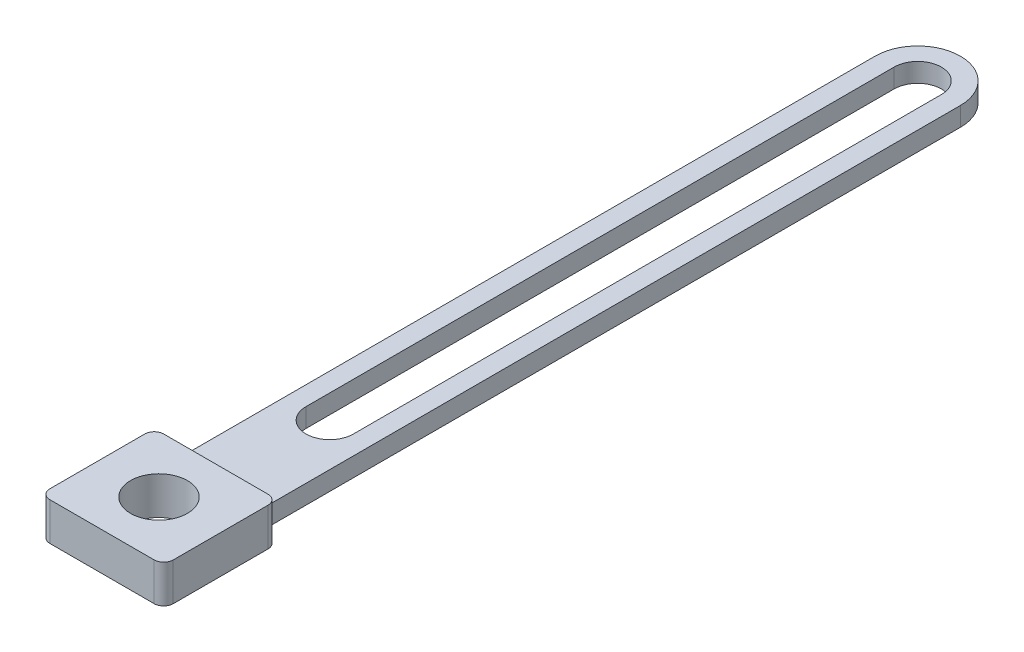
ISO-10303-21;
HEADER;
FILE_DESCRIPTION(('STEP AP214'),'2;1');
FILE_NAME('part.step','',(''),(''),'','','');
FILE_SCHEMA(('AUTOMOTIVE_DESIGN { 1 0 10303 214 1 1 1 1 }'));
ENDSEC;
DATA;
#1=APPLICATION_CONTEXT('core data for automotive mechanical design processes');
#2=APPLICATION_PROTOCOL_DEFINITION('international standard','automotive_design',2000,#1);
#3=PRODUCT_CONTEXT('',#1,'mechanical');
#4=PRODUCT('Part','Part','',(#3));
#5=PRODUCT_RELATED_PRODUCT_CATEGORY('part','',(#4));
#6=PRODUCT_DEFINITION_FORMATION('','',#4);
#7=PRODUCT_DEFINITION_CONTEXT('part definition',#1,'design');
#8=PRODUCT_DEFINITION('design','',#6,#7);
#9=PRODUCT_DEFINITION_SHAPE('','',#8);
#10=(LENGTH_UNIT() NAMED_UNIT(*) SI_UNIT(.MILLI.,.METRE.));
#11=(NAMED_UNIT(*) PLANE_ANGLE_UNIT() SI_UNIT($,.RADIAN.));
#12=(NAMED_UNIT(*) SI_UNIT($,.STERADIAN.) SOLID_ANGLE_UNIT());
#13=UNCERTAINTY_MEASURE_WITH_UNIT(LENGTH_MEASURE(1.E-05),#10,'distance_accuracy_value','');
#14=(GEOMETRIC_REPRESENTATION_CONTEXT(3) GLOBAL_UNCERTAINTY_ASSIGNED_CONTEXT((#13)) GLOBAL_UNIT_ASSIGNED_CONTEXT((#10,
#11,#12)) REPRESENTATION_CONTEXT('',''));
#15=CARTESIAN_POINT('',(0.,0.,0.));
#16=DIRECTION('',(0.,0.,1.));
#17=DIRECTION('',(1.,0.,0.));
#18=AXIS2_PLACEMENT_3D('',#15,#16,#17);
#19=CARTESIAN_POINT('',(-7.38157894736842,1.,-14.9605263157895));
#20=DIRECTION('',(1.,0.,0.));
#21=DIRECTION('',(0.,0.,-1.));
#22=AXIS2_PLACEMENT_3D('',#19,#20,#21);
#23=PLANE('',#22);
#24=DIRECTION('',(0.,-1.,0.));
#25=VECTOR('',#24,1.);
#26=CARTESIAN_POINT('',(-7.38157894736841,1.,59.0394736842105));
#27=LINE('',#26,#25);
#28=CARTESIAN_POINT('',(-7.38157894736842,1.,59.0394736842105));
#29=VERTEX_POINT('',#28);
#30=CARTESIAN_POINT('',(-7.38157894736841,-1.,59.0394736842105));
#31=VERTEX_POINT('',#30);
#32=EDGE_CURVE('E178',#29,#31,#27,.T.);
#33=ORIENTED_EDGE('',*,*,#32,.F.);
#34=DIRECTION('',(0.,0.,1.));
#35=VECTOR('',#34,1.);
#36=CARTESIAN_POINT('',(-7.38157894736842,1.,-14.9605263157895));
#37=LINE('',#36,#35);
#38=CARTESIAN_POINT('',(-7.38157894736842,1.,-14.9605263157895));
#39=VERTEX_POINT('',#38);
#40=EDGE_CURVE('E163',#39,#29,#37,.T.);
#41=ORIENTED_EDGE('',*,*,#40,.F.);
#42=DIRECTION('',(0.,-1.,0.));
#43=VECTOR('',#42,1.);
#44=CARTESIAN_POINT('',(-7.38157894736842,1.,-14.9605263157895));
#45=LINE('',#44,#43);
#46=CARTESIAN_POINT('',(-7.38157894736842,-1.,-14.9605263157895));
#47=VERTEX_POINT('',#46);
#48=EDGE_CURVE('E263',#39,#47,#45,.T.);
#49=ORIENTED_EDGE('',*,*,#48,.T.);
#50=DIRECTION('',(0.,0.,1.));
#51=VECTOR('',#50,1.);
#52=CARTESIAN_POINT('',(-7.38157894736842,-1.,-14.9605263157895));
#53=LINE('',#52,#51);
#54=EDGE_CURVE('E179',#47,#31,#53,.T.);
#55=ORIENTED_EDGE('',*,*,#54,.T.);
#56=EDGE_LOOP('',(#33,#41,#49,#55));
#57=FACE_BOUND('',#56,.T.);
#58=ADVANCED_FACE('F49',(#57),#23,.F.);
#59=CARTESIAN_POINT('',(1.61842105263158,1.,-14.9605263157895));
#60=DIRECTION('',(-1.,0.,0.));
#61=DIRECTION('',(0.,0.,1.));
#62=AXIS2_PLACEMENT_3D('',#59,#60,#61);
#63=PLANE('',#62);
#64=DIRECTION('',(0.,1.,0.));
#65=VECTOR('',#64,1.);
#66=CARTESIAN_POINT('',(1.61842105263159,1.,59.0394736842105));
#67=LINE('',#66,#65);
#68=CARTESIAN_POINT('',(1.61842105263159,-1.,59.0394736842105));
#69=VERTEX_POINT('',#68);
#70=CARTESIAN_POINT('',(1.61842105263159,1.,59.0394736842105));
#71=VERTEX_POINT('',#70);
#72=EDGE_CURVE('E185',#69,#71,#67,.T.);
#73=ORIENTED_EDGE('',*,*,#72,.F.);
#74=DIRECTION('',(0.,0.,-1.));
#75=VECTOR('',#74,1.);
#76=CARTESIAN_POINT('',(1.61842105263158,-1.,-14.9605263157895));
#77=LINE('',#76,#75);
#78=CARTESIAN_POINT('',(1.61842105263158,-1.,-14.9605263157895));
#79=VERTEX_POINT('',#78);
#80=EDGE_CURVE('E248',#69,#79,#77,.T.);
#81=ORIENTED_EDGE('',*,*,#80,.T.);
#82=DIRECTION('',(0.,-1.,0.));
#83=VECTOR('',#82,1.);
#84=CARTESIAN_POINT('',(1.61842105263158,1.,-14.9605263157895));
#85=LINE('',#84,#83);
#86=CARTESIAN_POINT('',(1.61842105263158,1.,-14.9605263157895));
#87=VERTEX_POINT('',#86);
#88=EDGE_CURVE('E252',#87,#79,#85,.T.);
#89=ORIENTED_EDGE('',*,*,#88,.F.);
#90=DIRECTION('',(0.,0.,-1.));
#91=VECTOR('',#90,1.);
#92=CARTESIAN_POINT('',(1.61842105263158,1.,-14.9605263157895));
#93=LINE('',#92,#91);
#94=EDGE_CURVE('E175',#71,#87,#93,.T.);
#95=ORIENTED_EDGE('',*,*,#94,.F.);
#96=EDGE_LOOP('',(#73,#81,#89,#95));
#97=FACE_BOUND('',#96,.T.);
#98=ADVANCED_FACE('F381',(#97),#63,.F.);
#99=CARTESIAN_POINT('',(-2.88157894736842,1.,-14.9605263157895));
#100=DIRECTION('',(0.,-1.,0.));
#101=DIRECTION('',(0.,0.,-1.));
#102=AXIS2_PLACEMENT_3D('',#99,#100,#101);
#103=PLANE('',#102);
#104=DIRECTION('',(0.,0.,-1.));
#105=VECTOR('',#104,1.);
#106=CARTESIAN_POINT('',(-0.381578947368416,1.,-14.9605263157895));
#107=LINE('',#106,#105);
#108=CARTESIAN_POINT('',(-0.381578947368412,1.,47.0394736842105));
#109=VERTEX_POINT('',#108);
#110=CARTESIAN_POINT('',(-0.381578947368416,1.,-14.9605263157895));
#111=VERTEX_POINT('',#110);
#112=EDGE_CURVE('E223',#109,#111,#107,.T.);
#113=ORIENTED_EDGE('',*,*,#112,.F.);
#114=CARTESIAN_POINT('',(-2.88157894736841,1.,47.0394736842105));
#115=DIRECTION('',(0.,1.,0.));
#116=DIRECTION('',(0.,0.,1.));
#117=AXIS2_PLACEMENT_3D('',#114,#115,#116);
#118=CIRCLE('',#117,2.5);
#119=CARTESIAN_POINT('',(-5.38157894736841,1.,47.0394736842105));
#120=VERTEX_POINT('',#119);
#121=EDGE_CURVE('E184',#120,#109,#118,.T.);
#122=ORIENTED_EDGE('',*,*,#121,.F.);
#123=DIRECTION('',(0.,0.,1.));
#124=VECTOR('',#123,1.);
#125=CARTESIAN_POINT('',(-5.38157894736842,1.,-14.9605263157895));
#126=LINE('',#125,#124);
#127=CARTESIAN_POINT('',(-5.38157894736842,1.,-14.9605263157895));
#128=VERTEX_POINT('',#127);
#129=EDGE_CURVE('E208',#128,#120,#126,.T.);
#130=ORIENTED_EDGE('',*,*,#129,.F.);
#131=CARTESIAN_POINT('',(-2.88157894736842,1.,-14.9605263157895));
#132=DIRECTION('',(0.,1.,0.));
#133=DIRECTION('',(0.,0.,1.));
#134=AXIS2_PLACEMENT_3D('',#131,#132,#133);
#135=CIRCLE('',#134,2.5);
#136=EDGE_CURVE('E227',#111,#128,#135,.T.);
#137=ORIENTED_EDGE('',*,*,#136,.F.);
#138=EDGE_LOOP('',(#113,#122,#130,#137));
#139=FACE_BOUND('',#138,.T.);
#140=DIRECTION('',(-1.,0.,0.));
#141=VECTOR('',#140,1.);
#142=CARTESIAN_POINT('',(-2.88157894736842,1.,59.0394736842105));
#143=LINE('',#142,#141);
#144=EDGE_CURVE('E167',#71,#29,#143,.T.);
#145=ORIENTED_EDGE('',*,*,#144,.F.);
#146=ORIENTED_EDGE('',*,*,#94,.T.);
#147=CARTESIAN_POINT('',(-2.88157894736842,1.,-14.9605263157895));
#148=DIRECTION('',(0.,1.,0.));
#149=DIRECTION('',(0.,0.,-1.));
#150=AXIS2_PLACEMENT_3D('',#147,#148,#149);
#151=CIRCLE('',#150,4.5);
#152=EDGE_CURVE('E170',#87,#39,#151,.T.);
#153=ORIENTED_EDGE('',*,*,#152,.T.);
#154=ORIENTED_EDGE('',*,*,#40,.T.);
#155=EDGE_LOOP('',(#145,#146,#153,#154));
#156=FACE_BOUND('',#155,.T.);
#157=ADVANCED_FACE('F165',(#139,#156),#103,.F.);
#158=CARTESIAN_POINT('',(-2.88157894736842,1.,-14.9605263157895));
#159=DIRECTION('',(0.,-1.,0.));
#160=DIRECTION('',(0.,0.,-1.));
#161=AXIS2_PLACEMENT_3D('',#158,#159,#160);
#162=CYLINDRICAL_SURFACE('',#161,4.5);
#163=CARTESIAN_POINT('',(-2.88157894736842,-1.,-14.9605263157895));
#164=DIRECTION('',(0.,1.,0.));
#165=DIRECTION('',(0.,0.,-1.));
#166=AXIS2_PLACEMENT_3D('',#163,#164,#165);
#167=CIRCLE('',#166,4.5);
#168=EDGE_CURVE('E237',#79,#47,#167,.T.);
#169=ORIENTED_EDGE('',*,*,#168,.T.);
#170=ORIENTED_EDGE('',*,*,#48,.F.);
#171=ORIENTED_EDGE('',*,*,#152,.F.);
#172=ORIENTED_EDGE('',*,*,#88,.T.);
#173=EDGE_LOOP('',(#169,#170,#171,#172));
#174=FACE_BOUND('',#173,.T.);
#175=ADVANCED_FACE('F385',(#174),#162,.T.);
#176=CARTESIAN_POINT('',(-2.88157894736842,-1.,-14.9605263157895));
#177=DIRECTION('',(0.,-1.,0.));
#178=DIRECTION('',(0.,0.,-1.));
#179=AXIS2_PLACEMENT_3D('',#176,#177,#178);
#180=PLANE('',#179);
#181=CARTESIAN_POINT('',(-2.88157894736842,-1.,65.0394736842105));
#182=DIRECTION('',(0.,1.,0.));
#183=DIRECTION('',(0.,0.,1.));
#184=AXIS2_PLACEMENT_3D('',#181,#182,#183);
#185=CIRCLE('',#184,3.);
#186=CARTESIAN_POINT('',(-2.88157894736842,-1.,68.0394736842105));
#187=VERTEX_POINT('',#186);
#188=EDGE_CURVE('E334',#187,#187,#185,.T.);
#189=ORIENTED_EDGE('',*,*,#188,.T.);
#190=EDGE_LOOP('',(#189));
#191=FACE_BOUND('',#190,.T.);
#192=DIRECTION('',(0.,0.,1.));
#193=VECTOR('',#192,1.);
#194=CARTESIAN_POINT('',(-9.38157894736842,-1.,59.0394736842105));
#195=LINE('',#194,#193);
#196=CARTESIAN_POINT('',(-9.38157894736842,-1.,60.0394736842105));
#197=VERTEX_POINT('',#196);
#198=CARTESIAN_POINT('',(-9.38157894736841,-1.,70.0394736842105));
#199=VERTEX_POINT('',#198);
#200=EDGE_CURVE('E329',#197,#199,#195,.T.);
#201=ORIENTED_EDGE('',*,*,#200,.F.);
#202=CARTESIAN_POINT('',(-8.38157894736842,-1.,60.0394736842105));
#203=DIRECTION('',(0.,-1.,0.));
#204=DIRECTION('',(0.,0.,-1.));
#205=AXIS2_PLACEMENT_3D('',#202,#203,#204);
#206=CIRCLE('',#205,1.);
#207=CARTESIAN_POINT('',(-8.38157894736842,-1.,59.0394736842105));
#208=VERTEX_POINT('',#207);
#209=EDGE_CURVE('E282',#197,#208,#206,.T.);
#210=ORIENTED_EDGE('',*,*,#209,.T.);
#211=DIRECTION('',(-1.,0.,0.));
#212=VECTOR('',#211,1.);
#213=CARTESIAN_POINT('',(-9.38157894736842,-1.,59.0394736842105));
#214=LINE('',#213,#212);
#215=EDGE_CURVE('E333',#31,#208,#214,.T.);
#216=ORIENTED_EDGE('',*,*,#215,.F.);
#217=ORIENTED_EDGE('',*,*,#54,.F.);
#218=ORIENTED_EDGE('',*,*,#168,.F.);
#219=ORIENTED_EDGE('',*,*,#80,.F.);
#220=CARTESIAN_POINT('',(2.61842105263159,-1.,59.0394736842105));
#221=VERTEX_POINT('',#220);
#222=EDGE_CURVE('E200',#221,#69,#214,.T.);
#223=ORIENTED_EDGE('',*,*,#222,.F.);
#224=CARTESIAN_POINT('',(2.61842105263159,-1.,60.0394736842105));
#225=DIRECTION('',(0.,-1.,0.));
#226=DIRECTION('',(0.,0.,-1.));
#227=AXIS2_PLACEMENT_3D('',#224,#225,#226);
#228=CIRCLE('',#227,1.);
#229=CARTESIAN_POINT('',(3.61842105263159,-1.,60.0394736842105));
#230=VERTEX_POINT('',#229);
#231=EDGE_CURVE('E279',#221,#230,#228,.T.);
#232=ORIENTED_EDGE('',*,*,#231,.T.);
#233=DIRECTION('',(0.,0.,-1.));
#234=VECTOR('',#233,1.);
#235=CARTESIAN_POINT('',(3.61842105263159,-1.,59.0394736842105));
#236=LINE('',#235,#234);
#237=CARTESIAN_POINT('',(3.61842105263159,-1.,70.0394736842105));
#238=VERTEX_POINT('',#237);
#239=EDGE_CURVE('E328',#238,#230,#236,.T.);
#240=ORIENTED_EDGE('',*,*,#239,.F.);
#241=CARTESIAN_POINT('',(2.61842105263159,-1.,70.0394736842105));
#242=DIRECTION('',(0.,-1.,0.));
#243=DIRECTION('',(0.,0.,-1.));
#244=AXIS2_PLACEMENT_3D('',#241,#242,#243);
#245=CIRCLE('',#244,1.);
#246=CARTESIAN_POINT('',(2.61842105263159,-1.,71.0394736842105));
#247=VERTEX_POINT('',#246);
#248=EDGE_CURVE('E276',#238,#247,#245,.T.);
#249=ORIENTED_EDGE('',*,*,#248,.T.);
#250=DIRECTION('',(1.,0.,0.));
#251=VECTOR('',#250,1.);
#252=CARTESIAN_POINT('',(-9.38157894736841,-1.,71.0394736842105));
#253=LINE('',#252,#251);
#254=CARTESIAN_POINT('',(-8.38157894736842,-1.,71.0394736842105));
#255=VERTEX_POINT('',#254);
#256=EDGE_CURVE('E316',#255,#247,#253,.T.);
#257=ORIENTED_EDGE('',*,*,#256,.F.);
#258=CARTESIAN_POINT('',(-8.38157894736842,-1.,70.0394736842105));
#259=DIRECTION('',(0.,-1.,0.));
#260=DIRECTION('',(0.,0.,-1.));
#261=AXIS2_PLACEMENT_3D('',#258,#259,#260);
#262=CIRCLE('',#261,1.);
#263=EDGE_CURVE('E273',#255,#199,#262,.T.);
#264=ORIENTED_EDGE('',*,*,#263,.T.);
#265=EDGE_LOOP('',(#201,#210,#216,#217,#218,#219,#223,#232,#240,#249,#257,#264));
#266=FACE_BOUND('',#265,.T.);
#267=CARTESIAN_POINT('',(-2.88157894736841,-1.,47.0394736842105));
#268=DIRECTION('',(0.,1.,0.));
#269=DIRECTION('',(0.,0.,1.));
#270=AXIS2_PLACEMENT_3D('',#267,#268,#269);
#271=CIRCLE('',#270,2.5);
#272=CARTESIAN_POINT('',(-5.38157894736841,-1.,47.0394736842105));
#273=VERTEX_POINT('',#272);
#274=CARTESIAN_POINT('',(-0.381578947368412,-1.,47.0394736842105));
#275=VERTEX_POINT('',#274);
#276=EDGE_CURVE('E203',#273,#275,#271,.T.);
#277=ORIENTED_EDGE('',*,*,#276,.T.);
#278=DIRECTION('',(0.,0.,-1.));
#279=VECTOR('',#278,1.);
#280=CARTESIAN_POINT('',(-0.381578947368416,-1.,-14.9605263157895));
#281=LINE('',#280,#279);
#282=CARTESIAN_POINT('',(-0.381578947368416,-1.,-14.9605263157895));
#283=VERTEX_POINT('',#282);
#284=EDGE_CURVE('E207',#275,#283,#281,.T.);
#285=ORIENTED_EDGE('',*,*,#284,.T.);
#286=CARTESIAN_POINT('',(-2.88157894736842,-1.,-14.9605263157895));
#287=DIRECTION('',(0.,1.,0.));
#288=DIRECTION('',(0.,0.,1.));
#289=AXIS2_PLACEMENT_3D('',#286,#287,#288);
#290=CIRCLE('',#289,2.5);
#291=CARTESIAN_POINT('',(-5.38157894736842,-1.,-14.9605263157895));
#292=VERTEX_POINT('',#291);
#293=EDGE_CURVE('E212',#283,#292,#290,.T.);
#294=ORIENTED_EDGE('',*,*,#293,.T.);
#295=DIRECTION('',(0.,0.,1.));
#296=VECTOR('',#295,1.);
#297=CARTESIAN_POINT('',(-5.38157894736842,-1.,-14.9605263157895));
#298=LINE('',#297,#296);
#299=EDGE_CURVE('E216',#292,#273,#298,.T.);
#300=ORIENTED_EDGE('',*,*,#299,.T.);
#301=EDGE_LOOP('',(#277,#285,#294,#300));
#302=FACE_BOUND('',#301,.T.);
#303=ADVANCED_FACE('F323',(#191,#266,#302),#180,.T.);
#304=CARTESIAN_POINT('',(-2.88157894736841,-1.,47.0394736842105));
#305=DIRECTION('',(0.,1.,0.));
#306=DIRECTION('',(0.,0.,1.));
#307=AXIS2_PLACEMENT_3D('',#304,#305,#306);
#308=CYLINDRICAL_SURFACE('',#307,2.5);
#309=ORIENTED_EDGE('',*,*,#121,.T.);
#310=DIRECTION('',(0.,1.,0.));
#311=VECTOR('',#310,1.);
#312=CARTESIAN_POINT('',(-0.381578947368412,-1.,47.0394736842105));
#313=LINE('',#312,#311);
#314=EDGE_CURVE('E220',#275,#109,#313,.T.);
#315=ORIENTED_EDGE('',*,*,#314,.F.);
#316=ORIENTED_EDGE('',*,*,#276,.F.);
#317=DIRECTION('',(0.,1.,0.));
#318=VECTOR('',#317,1.);
#319=CARTESIAN_POINT('',(-5.38157894736841,-1.,47.0394736842105));
#320=LINE('',#319,#318);
#321=EDGE_CURVE('E234',#273,#120,#320,.T.);
#322=ORIENTED_EDGE('',*,*,#321,.T.);
#323=EDGE_LOOP('',(#309,#315,#316,#322));
#324=FACE_BOUND('',#323,.T.);
#325=ADVANCED_FACE('F392',(#324),#308,.F.);
#326=CARTESIAN_POINT('',(-5.38157894736842,-1.,-14.9605263157895));
#327=DIRECTION('',(-1.,0.,0.));
#328=DIRECTION('',(0.,0.,1.));
#329=AXIS2_PLACEMENT_3D('',#326,#327,#328);
#330=PLANE('',#329);
#331=ORIENTED_EDGE('',*,*,#129,.T.);
#332=ORIENTED_EDGE('',*,*,#321,.F.);
#333=ORIENTED_EDGE('',*,*,#299,.F.);
#334=DIRECTION('',(0.,1.,0.));
#335=VECTOR('',#334,1.);
#336=CARTESIAN_POINT('',(-5.38157894736842,-1.,-14.9605263157895));
#337=LINE('',#336,#335);
#338=EDGE_CURVE('E238',#292,#128,#337,.T.);
#339=ORIENTED_EDGE('',*,*,#338,.T.);
#340=EDGE_LOOP('',(#331,#332,#333,#339));
#341=FACE_BOUND('',#340,.T.);
#342=ADVANCED_FACE('F406',(#341),#330,.F.);
#343=CARTESIAN_POINT('',(-2.88157894736842,-1.,-14.9605263157895));
#344=DIRECTION('',(0.,1.,0.));
#345=DIRECTION('',(0.,0.,1.));
#346=AXIS2_PLACEMENT_3D('',#343,#344,#345);
#347=CYLINDRICAL_SURFACE('',#346,2.5);
#348=ORIENTED_EDGE('',*,*,#136,.T.);
#349=ORIENTED_EDGE('',*,*,#338,.F.);
#350=ORIENTED_EDGE('',*,*,#293,.F.);
#351=DIRECTION('',(0.,1.,0.));
#352=VECTOR('',#351,1.);
#353=CARTESIAN_POINT('',(-0.381578947368416,-1.,-14.9605263157895));
#354=LINE('',#353,#352);
#355=EDGE_CURVE('E241',#283,#111,#354,.T.);
#356=ORIENTED_EDGE('',*,*,#355,.T.);
#357=EDGE_LOOP('',(#348,#349,#350,#356));
#358=FACE_BOUND('',#357,.T.);
#359=ADVANCED_FACE('F411',(#358),#347,.F.);
#360=CARTESIAN_POINT('',(-0.381578947368416,-1.,-14.9605263157895));
#361=DIRECTION('',(1.,0.,0.));
#362=DIRECTION('',(0.,0.,-1.));
#363=AXIS2_PLACEMENT_3D('',#360,#361,#362);
#364=PLANE('',#363);
#365=ORIENTED_EDGE('',*,*,#112,.T.);
#366=ORIENTED_EDGE('',*,*,#355,.F.);
#367=ORIENTED_EDGE('',*,*,#284,.F.);
#368=ORIENTED_EDGE('',*,*,#314,.T.);
#369=EDGE_LOOP('',(#365,#366,#367,#368));
#370=FACE_BOUND('',#369,.T.);
#371=ADVANCED_FACE('F408',(#370),#364,.F.);
#372=CARTESIAN_POINT('',(-9.38157894736842,3.,59.0394736842105));
#373=DIRECTION('',(0.,0.,1.));
#374=DIRECTION('',(1.,0.,0.));
#375=AXIS2_PLACEMENT_3D('',#372,#373,#374);
#376=PLANE('',#375);
#377=ORIENTED_EDGE('',*,*,#215,.T.);
#378=DIRECTION('',(0.,-1.,0.));
#379=VECTOR('',#378,1.);
#380=CARTESIAN_POINT('',(-8.38157894736842,3.,59.0394736842105));
#381=LINE('',#380,#379);
#382=CARTESIAN_POINT('',(-8.38157894736842,3.,59.0394736842105));
#383=VERTEX_POINT('',#382);
#384=EDGE_CURVE('E289',#208,#383,#381,.F.);
#385=ORIENTED_EDGE('',*,*,#384,.T.);
#386=DIRECTION('',(-1.,0.,0.));
#387=VECTOR('',#386,1.);
#388=CARTESIAN_POINT('',(-9.38157894736842,3.,59.0394736842105));
#389=LINE('',#388,#387);
#390=CARTESIAN_POINT('',(2.61842105263159,3.,59.0394736842105));
#391=VERTEX_POINT('',#390);
#392=EDGE_CURVE('E191',#391,#383,#389,.T.);
#393=ORIENTED_EDGE('',*,*,#392,.F.);
#394=DIRECTION('',(0.,-1.,0.));
#395=VECTOR('',#394,1.);
#396=CARTESIAN_POINT('',(2.61842105263159,3.,59.0394736842105));
#397=LINE('',#396,#395);
#398=EDGE_CURVE('E285',#391,#221,#397,.T.);
#399=ORIENTED_EDGE('',*,*,#398,.T.);
#400=ORIENTED_EDGE('',*,*,#222,.T.);
#401=ORIENTED_EDGE('',*,*,#72,.T.);
#402=ORIENTED_EDGE('',*,*,#144,.T.);
#403=ORIENTED_EDGE('',*,*,#32,.T.);
#404=EDGE_LOOP('',(#377,#385,#393,#399,#400,#401,#402,#403));
#405=FACE_BOUND('',#404,.T.);
#406=ADVANCED_FACE('F188',(#405),#376,.F.);
#407=CARTESIAN_POINT('',(-9.38157894736842,3.,59.0394736842105));
#408=DIRECTION('',(1.,0.,0.));
#409=DIRECTION('',(0.,0.,-1.));
#410=AXIS2_PLACEMENT_3D('',#407,#408,#409);
#411=PLANE('',#410);
#412=DIRECTION('',(0.,0.,1.));
#413=VECTOR('',#412,1.);
#414=CARTESIAN_POINT('',(-9.38157894736842,3.,59.0394736842105));
#415=LINE('',#414,#413);
#416=CARTESIAN_POINT('',(-9.38157894736842,3.,60.0394736842105));
#417=VERTEX_POINT('',#416);
#418=CARTESIAN_POINT('',(-9.38157894736841,3.,70.0394736842105));
#419=VERTEX_POINT('',#418);
#420=EDGE_CURVE('E341',#417,#419,#415,.T.);
#421=ORIENTED_EDGE('',*,*,#420,.F.);
#422=DIRECTION('',(0.,-1.,0.));
#423=VECTOR('',#422,1.);
#424=CARTESIAN_POINT('',(-9.38157894736842,3.,60.0394736842105));
#425=LINE('',#424,#423);
#426=EDGE_CURVE('E269',#417,#197,#425,.T.);
#427=ORIENTED_EDGE('',*,*,#426,.T.);
#428=ORIENTED_EDGE('',*,*,#200,.T.);
#429=DIRECTION('',(0.,-1.,0.));
#430=VECTOR('',#429,1.);
#431=CARTESIAN_POINT('',(-9.38157894736841,3.,70.0394736842105));
#432=LINE('',#431,#430);
#433=EDGE_CURVE('E266',#199,#419,#432,.F.);
#434=ORIENTED_EDGE('',*,*,#433,.T.);
#435=EDGE_LOOP('',(#421,#427,#428,#434));
#436=FACE_BOUND('',#435,.T.);
#437=ADVANCED_FACE('F374',(#436),#411,.F.);
#438=CARTESIAN_POINT('',(-9.38157894736841,3.,71.0394736842105));
#439=DIRECTION('',(0.,0.,-1.));
#440=DIRECTION('',(-1.,0.,0.));
#441=AXIS2_PLACEMENT_3D('',#438,#439,#440);
#442=PLANE('',#441);
#443=ORIENTED_EDGE('',*,*,#256,.T.);
#444=DIRECTION('',(0.,-1.,0.));
#445=VECTOR('',#444,1.);
#446=CARTESIAN_POINT('',(2.61842105263159,3.,71.0394736842105));
#447=LINE('',#446,#445);
#448=CARTESIAN_POINT('',(2.61842105263159,3.,71.0394736842105));
#449=VERTEX_POINT('',#448);
#450=EDGE_CURVE('E11',#247,#449,#447,.F.);
#451=ORIENTED_EDGE('',*,*,#450,.T.);
#452=DIRECTION('',(1.,0.,0.));
#453=VECTOR('',#452,1.);
#454=CARTESIAN_POINT('',(-9.38157894736841,3.,71.0394736842105));
#455=LINE('',#454,#453);
#456=CARTESIAN_POINT('',(-8.38157894736842,3.,71.0394736842105));
#457=VERTEX_POINT('',#456);
#458=EDGE_CURVE('E318',#457,#449,#455,.T.);
#459=ORIENTED_EDGE('',*,*,#458,.F.);
#460=DIRECTION('',(0.,-1.,0.));
#461=VECTOR('',#460,1.);
#462=CARTESIAN_POINT('',(-8.38157894736842,3.,71.0394736842105));
#463=LINE('',#462,#461);
#464=EDGE_CURVE('E58',#457,#255,#463,.T.);
#465=ORIENTED_EDGE('',*,*,#464,.T.);
#466=EDGE_LOOP('',(#443,#451,#459,#465));
#467=FACE_BOUND('',#466,.T.);
#468=ADVANCED_FACE('F315',(#467),#442,.F.);
#469=CARTESIAN_POINT('',(3.61842105263159,3.,59.0394736842105));
#470=DIRECTION('',(-1.,0.,0.));
#471=DIRECTION('',(0.,0.,1.));
#472=AXIS2_PLACEMENT_3D('',#469,#470,#471);
#473=PLANE('',#472);
#474=ORIENTED_EDGE('',*,*,#239,.T.);
#475=DIRECTION('',(0.,-1.,0.));
#476=VECTOR('',#475,1.);
#477=CARTESIAN_POINT('',(3.61842105263159,3.,60.0394736842105));
#478=LINE('',#477,#476);
#479=CARTESIAN_POINT('',(3.61842105263159,3.,60.0394736842105));
#480=VERTEX_POINT('',#479);
#481=EDGE_CURVE('E65',#230,#480,#478,.F.);
#482=ORIENTED_EDGE('',*,*,#481,.T.);
#483=DIRECTION('',(0.,0.,-1.));
#484=VECTOR('',#483,1.);
#485=CARTESIAN_POINT('',(3.61842105263159,3.,59.0394736842105));
#486=LINE('',#485,#484);
#487=CARTESIAN_POINT('',(3.61842105263159,3.,70.0394736842105));
#488=VERTEX_POINT('',#487);
#489=EDGE_CURVE('E197',#488,#480,#486,.T.);
#490=ORIENTED_EDGE('',*,*,#489,.F.);
#491=DIRECTION('',(0.,-1.,0.));
#492=VECTOR('',#491,1.);
#493=CARTESIAN_POINT('',(3.61842105263159,3.,70.0394736842105));
#494=LINE('',#493,#492);
#495=EDGE_CURVE('E303',#488,#238,#494,.T.);
#496=ORIENTED_EDGE('',*,*,#495,.T.);
#497=EDGE_LOOP('',(#474,#482,#490,#496));
#498=FACE_BOUND('',#497,.T.);
#499=ADVANCED_FACE('F363',(#498),#473,.F.);
#500=CARTESIAN_POINT('',(0.,3.,0.));
#501=DIRECTION('',(0.,1.,0.));
#502=DIRECTION('',(0.,0.,1.));
#503=AXIS2_PLACEMENT_3D('',#500,#501,#502);
#504=PLANE('',#503);
#505=CARTESIAN_POINT('',(-2.88157894736842,3.,65.0394736842105));
#506=DIRECTION('',(0.,1.,0.));
#507=DIRECTION('',(0.,0.,1.));
#508=AXIS2_PLACEMENT_3D('',#505,#506,#507);
#509=CIRCLE('',#508,3.);
#510=CARTESIAN_POINT('',(-2.88157894736842,3.,68.0394736842105));
#511=VERTEX_POINT('',#510);
#512=EDGE_CURVE('E345',#511,#511,#509,.T.);
#513=ORIENTED_EDGE('',*,*,#512,.F.);
#514=EDGE_LOOP('',(#513));
#515=FACE_BOUND('',#514,.T.);
#516=ORIENTED_EDGE('',*,*,#392,.T.);
#517=CARTESIAN_POINT('',(-8.38157894736842,3.,60.0394736842105));
#518=DIRECTION('',(0.,1.,0.));
#519=DIRECTION('',(0.,0.,1.));
#520=AXIS2_PLACEMENT_3D('',#517,#518,#519);
#521=CIRCLE('',#520,1.);
#522=EDGE_CURVE('E300',#383,#417,#521,.T.);
#523=ORIENTED_EDGE('',*,*,#522,.T.);
#524=ORIENTED_EDGE('',*,*,#420,.T.);
#525=CARTESIAN_POINT('',(-8.38157894736842,3.,70.0394736842105));
#526=DIRECTION('',(0.,1.,0.));
#527=DIRECTION('',(0.,0.,1.));
#528=AXIS2_PLACEMENT_3D('',#525,#526,#527);
#529=CIRCLE('',#528,1.);
#530=EDGE_CURVE('E292',#419,#457,#529,.T.);
#531=ORIENTED_EDGE('',*,*,#530,.T.);
#532=ORIENTED_EDGE('',*,*,#458,.T.);
#533=CARTESIAN_POINT('',(2.61842105263159,3.,70.0394736842105));
#534=DIRECTION('',(0.,1.,0.));
#535=DIRECTION('',(0.,0.,1.));
#536=AXIS2_PLACEMENT_3D('',#533,#534,#535);
#537=CIRCLE('',#536,1.);
#538=EDGE_CURVE('E72',#449,#488,#537,.T.);
#539=ORIENTED_EDGE('',*,*,#538,.T.);
#540=ORIENTED_EDGE('',*,*,#489,.T.);
#541=CARTESIAN_POINT('',(2.61842105263159,3.,60.0394736842105));
#542=DIRECTION('',(0.,1.,0.));
#543=DIRECTION('',(0.,0.,1.));
#544=AXIS2_PLACEMENT_3D('',#541,#542,#543);
#545=CIRCLE('',#544,1.);
#546=EDGE_CURVE('E297',#480,#391,#545,.T.);
#547=ORIENTED_EDGE('',*,*,#546,.T.);
#548=EDGE_LOOP('',(#516,#523,#524,#531,#532,#539,#540,#547));
#549=FACE_BOUND('',#548,.T.);
#550=ADVANCED_FACE('F360',(#515,#549),#504,.T.);
#551=CARTESIAN_POINT('',(-8.38157894736842,3.,60.0394736842105));
#552=DIRECTION('',(0.,-1.,0.));
#553=DIRECTION('',(0.,0.,-1.));
#554=AXIS2_PLACEMENT_3D('',#551,#552,#553);
#555=CYLINDRICAL_SURFACE('',#554,1.);
#556=ORIENTED_EDGE('',*,*,#522,.F.);
#557=ORIENTED_EDGE('',*,*,#384,.F.);
#558=ORIENTED_EDGE('',*,*,#209,.F.);
#559=ORIENTED_EDGE('',*,*,#426,.F.);
#560=EDGE_LOOP('',(#556,#557,#558,#559));
#561=FACE_BOUND('',#560,.T.);
#562=ADVANCED_FACE('F362',(#561),#555,.T.);
#563=CARTESIAN_POINT('',(2.61842105263159,3.,60.0394736842105));
#564=DIRECTION('',(0.,-1.,0.));
#565=DIRECTION('',(0.,0.,-1.));
#566=AXIS2_PLACEMENT_3D('',#563,#564,#565);
#567=CYLINDRICAL_SURFACE('',#566,1.);
#568=ORIENTED_EDGE('',*,*,#546,.F.);
#569=ORIENTED_EDGE('',*,*,#481,.F.);
#570=ORIENTED_EDGE('',*,*,#231,.F.);
#571=ORIENTED_EDGE('',*,*,#398,.F.);
#572=EDGE_LOOP('',(#568,#569,#570,#571));
#573=FACE_BOUND('',#572,.T.);
#574=ADVANCED_FACE('F486',(#573),#567,.T.);
#575=CARTESIAN_POINT('',(2.61842105263159,3.,70.0394736842105));
#576=DIRECTION('',(0.,-1.,0.));
#577=DIRECTION('',(0.,0.,-1.));
#578=AXIS2_PLACEMENT_3D('',#575,#576,#577);
#579=CYLINDRICAL_SURFACE('',#578,1.);
#580=ORIENTED_EDGE('',*,*,#538,.F.);
#581=ORIENTED_EDGE('',*,*,#450,.F.);
#582=ORIENTED_EDGE('',*,*,#248,.F.);
#583=ORIENTED_EDGE('',*,*,#495,.F.);
#584=EDGE_LOOP('',(#580,#581,#582,#583));
#585=FACE_BOUND('',#584,.T.);
#586=ADVANCED_FACE('F479',(#585),#579,.T.);
#587=CARTESIAN_POINT('',(-8.38157894736842,3.,70.0394736842105));
#588=DIRECTION('',(0.,-1.,0.));
#589=DIRECTION('',(0.,0.,-1.));
#590=AXIS2_PLACEMENT_3D('',#587,#588,#589);
#591=CYLINDRICAL_SURFACE('',#590,1.);
#592=ORIENTED_EDGE('',*,*,#530,.F.);
#593=ORIENTED_EDGE('',*,*,#433,.F.);
#594=ORIENTED_EDGE('',*,*,#263,.F.);
#595=ORIENTED_EDGE('',*,*,#464,.F.);
#596=EDGE_LOOP('',(#592,#593,#594,#595));
#597=FACE_BOUND('',#596,.T.);
#598=ADVANCED_FACE('F51',(#597),#591,.T.);
#599=CARTESIAN_POINT('',(-2.88157894736842,-1.,65.0394736842105));
#600=DIRECTION('',(0.,1.,0.));
#601=DIRECTION('',(0.,0.,1.));
#602=AXIS2_PLACEMENT_3D('',#599,#600,#601);
#603=CYLINDRICAL_SURFACE('',#602,3.);
#604=ORIENTED_EDGE('',*,*,#188,.F.);
#605=EDGE_LOOP('',(#604));
#606=FACE_BOUND('',#605,.T.);
#607=ORIENTED_EDGE('',*,*,#512,.T.);
#608=EDGE_LOOP('',(#607));
#609=FACE_BOUND('',#608,.T.);
#610=ADVANCED_FACE('F354',(#606,#609),#603,.F.);
#611=CLOSED_SHELL('',(#58,#98,#157,#175,#303,#325,#342,#359,#371,#406,#437,#468,#499,#550,#562,
#574,#586,#598,#610));
#612=MANIFOLD_SOLID_BREP('B2',#611);
#613=ADVANCED_BREP_SHAPE_REPRESENTATION('',(#18,#612),#14);
#614=SHAPE_DEFINITION_REPRESENTATION(#9,#613);
ENDSEC;
END-ISO-10303-21;
